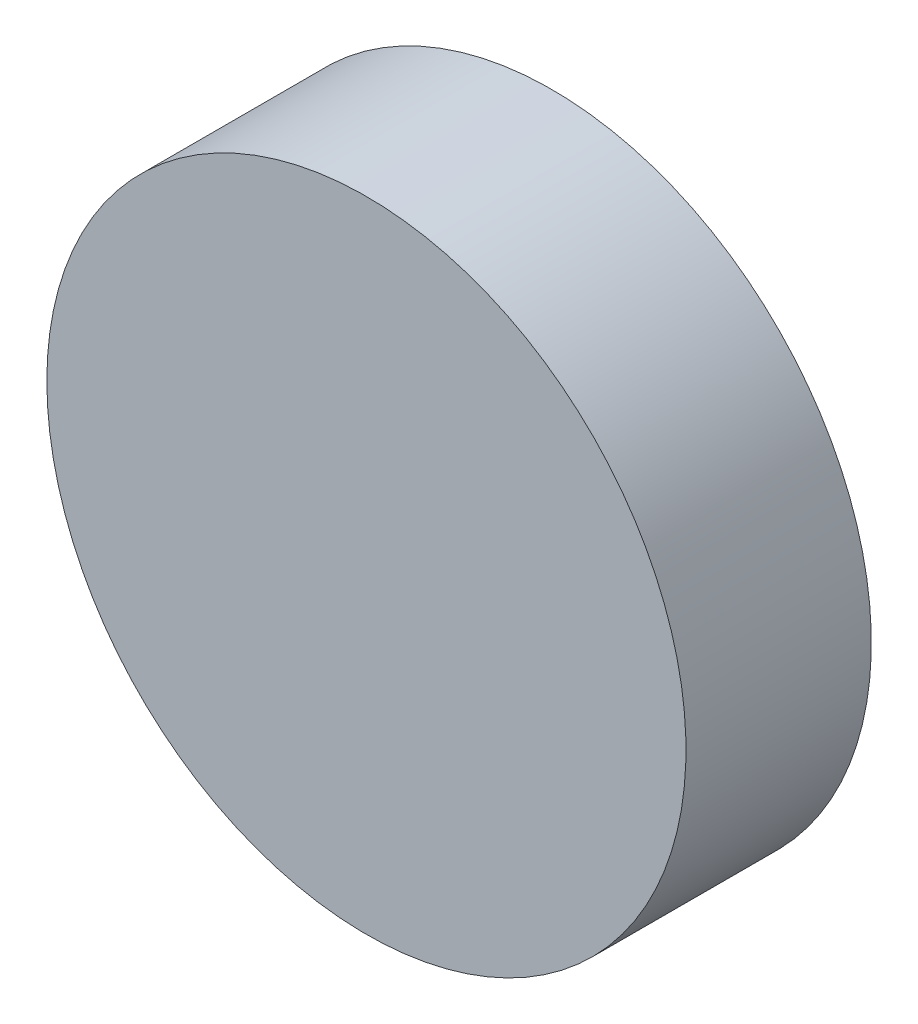
ISO-10303-21;
HEADER;
FILE_DESCRIPTION(('STEP AP214'),'2;1');
FILE_NAME('part.step','',(''),(''),'','','');
FILE_SCHEMA(('AUTOMOTIVE_DESIGN { 1 0 10303 214 1 1 1 1 }'));
ENDSEC;
DATA;
#1=APPLICATION_CONTEXT('core data for automotive mechanical design processes');
#2=APPLICATION_PROTOCOL_DEFINITION('international standard','automotive_design',2000,#1);
#3=PRODUCT_CONTEXT('',#1,'mechanical');
#4=PRODUCT('Part','Part','',(#3));
#5=PRODUCT_RELATED_PRODUCT_CATEGORY('part','',(#4));
#6=PRODUCT_DEFINITION_FORMATION('','',#4);
#7=PRODUCT_DEFINITION_CONTEXT('part definition',#1,'design');
#8=PRODUCT_DEFINITION('design','',#6,#7);
#9=PRODUCT_DEFINITION_SHAPE('','',#8);
#10=(LENGTH_UNIT() NAMED_UNIT(*) SI_UNIT(.MILLI.,.METRE.));
#11=(NAMED_UNIT(*) PLANE_ANGLE_UNIT() SI_UNIT($,.RADIAN.));
#12=(NAMED_UNIT(*) SI_UNIT($,.STERADIAN.) SOLID_ANGLE_UNIT());
#13=UNCERTAINTY_MEASURE_WITH_UNIT(LENGTH_MEASURE(1.E-05),#10,'distance_accuracy_value','');
#14=(GEOMETRIC_REPRESENTATION_CONTEXT(3) GLOBAL_UNCERTAINTY_ASSIGNED_CONTEXT((#13)) GLOBAL_UNIT_ASSIGNED_CONTEXT((#10,
#11,#12)) REPRESENTATION_CONTEXT('',''));
#15=CARTESIAN_POINT('',(0.,0.,0.));
#16=DIRECTION('',(0.,0.,1.));
#17=DIRECTION('',(1.,0.,0.));
#18=AXIS2_PLACEMENT_3D('',#15,#16,#17);
#19=CARTESIAN_POINT('',(0.,0.,29.));
#20=DIRECTION('',(0.,0.,-1.));
#21=DIRECTION('',(-1.,0.,0.));
#22=AXIS2_PLACEMENT_3D('',#19,#20,#21);
#23=CYLINDRICAL_SURFACE('',#22,50.);
#24=CARTESIAN_POINT('',(0.,0.,29.));
#25=DIRECTION('',(0.,0.,1.));
#26=DIRECTION('',(1.,0.,0.));
#27=AXIS2_PLACEMENT_3D('',#24,#25,#26);
#28=CIRCLE('',#27,50.);
#29=CARTESIAN_POINT('',(-50.,0.,29.));
#30=VERTEX_POINT('',#29);
#31=EDGE_CURVE('E10',#30,#30,#28,.T.);
#32=CARTESIAN_POINT('',(0.,0.,0.));
#33=DIRECTION('',(0.,0.,1.));
#34=DIRECTION('',(1.,0.,0.));
#35=AXIS2_PLACEMENT_3D('',#32,#33,#34);
#36=CIRCLE('',#35,50.);
#37=CARTESIAN_POINT('',(-50.,0.,0.));
#38=VERTEX_POINT('',#37);
#39=EDGE_CURVE('E38',#38,#38,#36,.T.);
#40=CARTESIAN_POINT('',(-50.,0.,29.));
#41=CARTESIAN_POINT('',(-50.,0.,28.6979166666667));
#42=CARTESIAN_POINT('',(-50.,0.,28.3958333333333));
#43=CARTESIAN_POINT('',(-50.,0.,27.7916666666667));
#44=CARTESIAN_POINT('',(-50.,0.,27.4895833333333));
#45=CARTESIAN_POINT('',(-50.,0.,26.8854166666667));
#46=CARTESIAN_POINT('',(-50.,0.,26.5833333333333));
#47=CARTESIAN_POINT('',(-50.,0.,25.9791666666667));
#48=CARTESIAN_POINT('',(-50.,0.,25.6770833333333));
#49=CARTESIAN_POINT('',(-50.,0.,25.0729166666667));
#50=CARTESIAN_POINT('',(-50.,0.,24.7708333333333));
#51=CARTESIAN_POINT('',(-50.,0.,24.1666666666667));
#52=CARTESIAN_POINT('',(-50.,0.,23.8645833333333));
#53=CARTESIAN_POINT('',(-50.,0.,23.2604166666667));
#54=CARTESIAN_POINT('',(-50.,0.,22.9583333333333));
#55=CARTESIAN_POINT('',(-50.,0.,22.3541666666667));
#56=CARTESIAN_POINT('',(-50.,0.,22.0520833333333));
#57=CARTESIAN_POINT('',(-50.,0.,21.4479166666667));
#58=CARTESIAN_POINT('',(-50.,0.,21.1458333333333));
#59=CARTESIAN_POINT('',(-50.,0.,20.5416666666667));
#60=CARTESIAN_POINT('',(-50.,0.,20.2395833333333));
#61=CARTESIAN_POINT('',(-50.,0.,19.6354166666667));
#62=CARTESIAN_POINT('',(-50.,0.,19.3333333333333));
#63=CARTESIAN_POINT('',(-50.,0.,18.7291666666667));
#64=CARTESIAN_POINT('',(-50.,0.,18.4270833333333));
#65=CARTESIAN_POINT('',(-50.,0.,17.8229166666667));
#66=CARTESIAN_POINT('',(-50.,0.,17.5208333333333));
#67=CARTESIAN_POINT('',(-50.,0.,16.9166666666667));
#68=CARTESIAN_POINT('',(-50.,0.,16.6145833333333));
#69=CARTESIAN_POINT('',(-50.,0.,16.0104166666667));
#70=CARTESIAN_POINT('',(-50.,0.,15.7083333333333));
#71=CARTESIAN_POINT('',(-50.,0.,15.1041666666667));
#72=CARTESIAN_POINT('',(-50.,0.,14.8020833333333));
#73=CARTESIAN_POINT('',(-50.,0.,14.1979166666667));
#74=CARTESIAN_POINT('',(-50.,0.,13.8958333333333));
#75=CARTESIAN_POINT('',(-50.,0.,13.2916666666667));
#76=CARTESIAN_POINT('',(-50.,0.,12.9895833333333));
#77=CARTESIAN_POINT('',(-50.,0.,12.3854166666667));
#78=CARTESIAN_POINT('',(-50.,0.,12.0833333333333));
#79=CARTESIAN_POINT('',(-50.,0.,11.4791666666667));
#80=CARTESIAN_POINT('',(-50.,0.,11.1770833333333));
#81=CARTESIAN_POINT('',(-50.,0.,10.5729166666667));
#82=CARTESIAN_POINT('',(-50.,0.,10.2708333333333));
#83=CARTESIAN_POINT('',(-50.,0.,9.66666666666667));
#84=CARTESIAN_POINT('',(-50.,0.,9.36458333333333));
#85=CARTESIAN_POINT('',(-50.,0.,8.76041666666667));
#86=CARTESIAN_POINT('',(-50.,0.,8.45833333333333));
#87=CARTESIAN_POINT('',(-50.,0.,7.85416666666667));
#88=CARTESIAN_POINT('',(-50.,0.,7.55208333333333));
#89=CARTESIAN_POINT('',(-50.,0.,6.94791666666667));
#90=CARTESIAN_POINT('',(-50.,0.,6.64583333333333));
#91=CARTESIAN_POINT('',(-50.,0.,6.04166666666667));
#92=CARTESIAN_POINT('',(-50.,0.,5.73958333333333));
#93=CARTESIAN_POINT('',(-50.,0.,5.13541666666667));
#94=CARTESIAN_POINT('',(-50.,0.,4.83333333333333));
#95=CARTESIAN_POINT('',(-50.,0.,4.22916666666667));
#96=CARTESIAN_POINT('',(-50.,0.,3.92708333333333));
#97=CARTESIAN_POINT('',(-50.,0.,3.32291666666667));
#98=CARTESIAN_POINT('',(-50.,0.,3.02083333333333));
#99=CARTESIAN_POINT('',(-50.,0.,2.41666666666667));
#100=CARTESIAN_POINT('',(-50.,0.,2.11458333333333));
#101=CARTESIAN_POINT('',(-50.,0.,1.51041666666667));
#102=CARTESIAN_POINT('',(-50.,0.,1.20833333333333));
#103=CARTESIAN_POINT('',(-50.,0.,0.604166666666667));
#104=CARTESIAN_POINT('',(-50.,0.,0.302083333333333));
#105=CARTESIAN_POINT('',(-50.,0.,0.));
#106=B_SPLINE_CURVE_WITH_KNOTS('',3,(#40,#41,#42,#43,#44,#45,#46,#47,#48,#49,#50,#51,#52,#53,
#54,#55,#56,#57,#58,#59,#60,#61,#62,#63,#64,#65,#66,#67,#68,#69,#70,#71,#72,#73,#74,#75,#76,#77,
#78,#79,#80,#81,#82,#83,#84,#85,#86,#87,#88,#89,#90,#91,#92,#93,#94,#95,#96,#97,#98,#99,#100,
#101,#102,#103,#104,#105),.UNSPECIFIED.,.F.,.F.,(4,2,2,2,2,2,2,2,2,2,2,2,2,2,2,2,2,2,2,2,2,2,2,
2,2,2,2,2,2,2,2,2,4),(0.,0.906250000000001,1.8125,2.71875,3.625,4.53125,5.4375,6.34375,7.25,
8.15625,9.0625,9.96875,10.875,11.78125,12.6875,13.59375,14.5,15.40625,16.3125,17.21875,18.125,
19.03125,19.9375,20.84375,21.75,22.65625,23.5625,24.46875,25.375,26.28125,27.1875,28.09375,29.),.UNSPECIFIED.);
#107=EDGE_CURVE('BSEAM35',#30,#38,#106,.T.);
#108=ORIENTED_EDGE('',*,*,#31,.F.);
#109=ORIENTED_EDGE('',*,*,#39,.T.);
#110=ORIENTED_EDGE('',*,*,#107,.T.);
#111=ORIENTED_EDGE('',*,*,#107,.F.);
#112=EDGE_LOOP('',(#108,#110,#109,#111));
#113=FACE_BOUND('',#112,.T.);
#114=ADVANCED_FACE('F35',(#113),#23,.T.);
#115=CARTESIAN_POINT('',(0.,0.,29.));
#116=DIRECTION('',(0.,0.,1.));
#117=DIRECTION('',(1.,0.,0.));
#118=AXIS2_PLACEMENT_3D('',#115,#116,#117);
#119=PLANE('',#118);
#120=ORIENTED_EDGE('',*,*,#31,.T.);
#121=EDGE_LOOP('',(#120));
#122=FACE_BOUND('',#121,.T.);
#123=ADVANCED_FACE('F50',(#122),#119,.T.);
#124=CARTESIAN_POINT('',(0.,0.,0.));
#125=DIRECTION('',(0.,0.,1.));
#126=DIRECTION('',(1.,0.,0.));
#127=AXIS2_PLACEMENT_3D('',#124,#125,#126);
#128=PLANE('',#127);
#129=ORIENTED_EDGE('',*,*,#39,.F.);
#130=EDGE_LOOP('',(#129));
#131=FACE_BOUND('',#130,.T.);
#132=ADVANCED_FACE('F48',(#131),#128,.F.);
#133=CLOSED_SHELL('',(#114,#123,#132));
#134=MANIFOLD_SOLID_BREP('B2',#133);
#135=ADVANCED_BREP_SHAPE_REPRESENTATION('',(#18,#134),#14);
#136=SHAPE_DEFINITION_REPRESENTATION(#9,#135);
ENDSEC;
END-ISO-10303-21;
